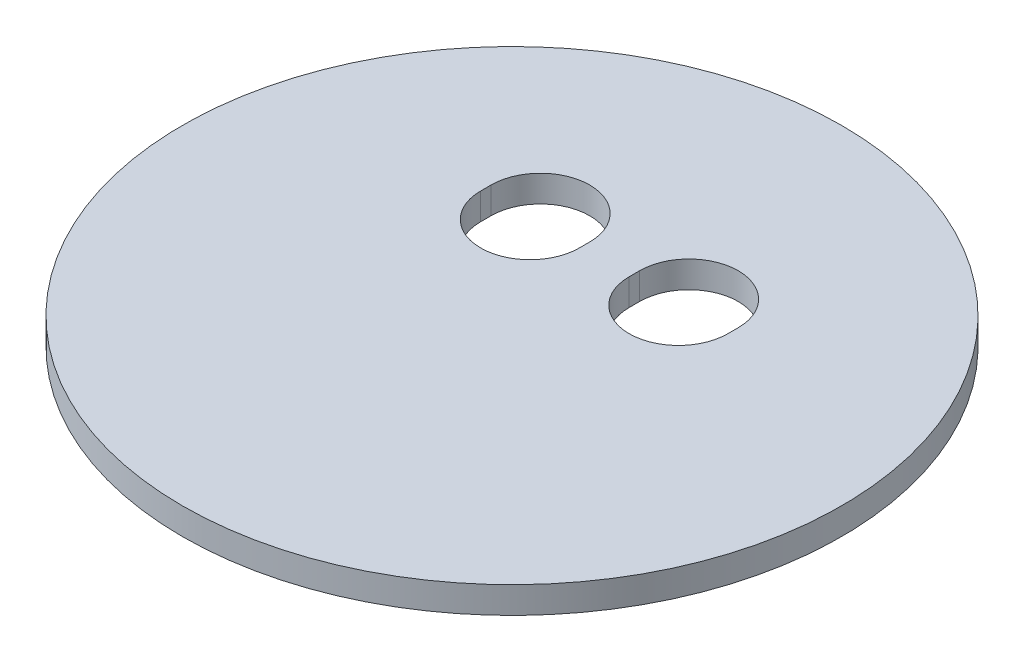
ISO-10303-21;
HEADER;
FILE_DESCRIPTION(('STEP AP214'),'2;1');
FILE_NAME('part.step','',(''),(''),'','','');
FILE_SCHEMA(('AUTOMOTIVE_DESIGN { 1 0 10303 214 1 1 1 1 }'));
ENDSEC;
DATA;
#1=APPLICATION_CONTEXT('core data for automotive mechanical design processes');
#2=APPLICATION_PROTOCOL_DEFINITION('international standard','automotive_design',2000,#1);
#3=PRODUCT_CONTEXT('',#1,'mechanical');
#4=PRODUCT('Part','Part','',(#3));
#5=PRODUCT_RELATED_PRODUCT_CATEGORY('part','',(#4));
#6=PRODUCT_DEFINITION_FORMATION('','',#4);
#7=PRODUCT_DEFINITION_CONTEXT('part definition',#1,'design');
#8=PRODUCT_DEFINITION('design','',#6,#7);
#9=PRODUCT_DEFINITION_SHAPE('','',#8);
#10=(LENGTH_UNIT() NAMED_UNIT(*) SI_UNIT(.MILLI.,.METRE.));
#11=(NAMED_UNIT(*) PLANE_ANGLE_UNIT() SI_UNIT($,.RADIAN.));
#12=(NAMED_UNIT(*) SI_UNIT($,.STERADIAN.) SOLID_ANGLE_UNIT());
#13=UNCERTAINTY_MEASURE_WITH_UNIT(LENGTH_MEASURE(1.E-05),#10,'distance_accuracy_value','');
#14=(GEOMETRIC_REPRESENTATION_CONTEXT(3) GLOBAL_UNCERTAINTY_ASSIGNED_CONTEXT((#13)) GLOBAL_UNIT_ASSIGNED_CONTEXT((#10,
#11,#12)) REPRESENTATION_CONTEXT('',''));
#15=CARTESIAN_POINT('',(0.,0.,0.));
#16=DIRECTION('',(0.,0.,1.));
#17=DIRECTION('',(1.,0.,0.));
#18=AXIS2_PLACEMENT_3D('',#15,#16,#17);
#19=CARTESIAN_POINT('',(0.,1.,0.));
#20=DIRECTION('',(0.,-1.,0.));
#21=DIRECTION('',(0.,0.,-1.));
#22=AXIS2_PLACEMENT_3D('',#19,#20,#21);
#23=CYLINDRICAL_SURFACE('',#22,12.36);
#24=CARTESIAN_POINT('',(0.,1.,0.));
#25=DIRECTION('',(0.,1.,0.));
#26=DIRECTION('',(0.,0.,1.));
#27=AXIS2_PLACEMENT_3D('',#24,#25,#26);
#28=CIRCLE('',#27,12.36);
#29=CARTESIAN_POINT('',(0.,1.,12.36));
#30=VERTEX_POINT('',#29);
#31=EDGE_CURVE('E11',#30,#30,#28,.T.);
#32=ORIENTED_EDGE('',*,*,#31,.F.);
#33=EDGE_LOOP('',(#32));
#34=FACE_BOUND('',#33,.T.);
#35=CARTESIAN_POINT('',(0.,0.,0.));
#36=DIRECTION('',(0.,1.,0.));
#37=DIRECTION('',(0.,0.,1.));
#38=AXIS2_PLACEMENT_3D('',#35,#36,#37);
#39=CIRCLE('',#38,12.36);
#40=CARTESIAN_POINT('',(0.,0.,12.36));
#41=VERTEX_POINT('',#40);
#42=EDGE_CURVE('E45',#41,#41,#39,.T.);
#43=ORIENTED_EDGE('',*,*,#42,.T.);
#44=EDGE_LOOP('',(#43));
#45=FACE_BOUND('',#44,.T.);
#46=ADVANCED_FACE('F42',(#34,#45),#23,.T.);
#47=CARTESIAN_POINT('',(0.,1.,0.));
#48=DIRECTION('',(0.,1.,0.));
#49=DIRECTION('',(0.,0.,1.));
#50=AXIS2_PLACEMENT_3D('',#47,#48,#49);
#51=PLANE('',#50);
#52=CARTESIAN_POINT('',(-2.785,1.,-3.85));
#53=DIRECTION('',(0.,1.,0.));
#54=DIRECTION('',(0.,0.,1.));
#55=AXIS2_PLACEMENT_3D('',#52,#53,#54);
#56=CIRCLE('',#55,1.85);
#57=CARTESIAN_POINT('',(-0.935000000000001,1.,-3.85));
#58=VERTEX_POINT('',#57);
#59=CARTESIAN_POINT('',(-4.635,1.,-3.85));
#60=VERTEX_POINT('',#59);
#61=EDGE_CURVE('E57',#58,#60,#56,.T.);
#62=ORIENTED_EDGE('',*,*,#61,.F.);
#63=DIRECTION('',(0.,0.,-1.));
#64=VECTOR('',#63,1.);
#65=CARTESIAN_POINT('',(-0.935000000000001,1.,-3.85));
#66=LINE('',#65,#64);
#67=CARTESIAN_POINT('',(-0.935000000000001,1.,-3.46000000000001));
#68=VERTEX_POINT('',#67);
#69=EDGE_CURVE('E131',#68,#58,#66,.T.);
#70=ORIENTED_EDGE('',*,*,#69,.F.);
#71=CARTESIAN_POINT('',(-2.785,1.,-3.46));
#72=DIRECTION('',(0.,1.,0.));
#73=DIRECTION('',(0.,0.,1.));
#74=AXIS2_PLACEMENT_3D('',#71,#72,#73);
#75=CIRCLE('',#74,1.85);
#76=CARTESIAN_POINT('',(-4.635,1.,-3.46));
#77=VERTEX_POINT('',#76);
#78=EDGE_CURVE('E135',#77,#68,#75,.T.);
#79=ORIENTED_EDGE('',*,*,#78,.F.);
#80=DIRECTION('',(0.,0.,1.));
#81=VECTOR('',#80,1.);
#82=CARTESIAN_POINT('',(-4.635,1.,-3.85));
#83=LINE('',#82,#81);
#84=EDGE_CURVE('E144',#60,#77,#83,.T.);
#85=ORIENTED_EDGE('',*,*,#84,.F.);
#86=EDGE_LOOP('',(#62,#70,#79,#85));
#87=FACE_BOUND('',#86,.T.);
#88=CARTESIAN_POINT('',(2.785,1.,-3.85));
#89=DIRECTION('',(0.,1.,0.));
#90=DIRECTION('',(0.,0.,1.));
#91=AXIS2_PLACEMENT_3D('',#88,#89,#90);
#92=CIRCLE('',#91,1.85);
#93=CARTESIAN_POINT('',(4.635,1.,-3.85));
#94=VERTEX_POINT('',#93);
#95=CARTESIAN_POINT('',(0.934999999999997,1.,-3.85));
#96=VERTEX_POINT('',#95);
#97=EDGE_CURVE('E65',#94,#96,#92,.T.);
#98=ORIENTED_EDGE('',*,*,#97,.F.);
#99=DIRECTION('',(0.,0.,-1.));
#100=VECTOR('',#99,1.);
#101=CARTESIAN_POINT('',(4.635,1.,-3.85));
#102=LINE('',#101,#100);
#103=CARTESIAN_POINT('',(4.635,1.,-3.46));
#104=VERTEX_POINT('',#103);
#105=EDGE_CURVE('E171',#104,#94,#102,.T.);
#106=ORIENTED_EDGE('',*,*,#105,.F.);
#107=CARTESIAN_POINT('',(2.785,1.,-3.46));
#108=DIRECTION('',(0.,1.,0.));
#109=DIRECTION('',(0.,0.,1.));
#110=AXIS2_PLACEMENT_3D('',#107,#108,#109);
#111=CIRCLE('',#110,1.85);
#112=CARTESIAN_POINT('',(0.934999999999996,1.,-3.46));
#113=VERTEX_POINT('',#112);
#114=EDGE_CURVE('E175',#113,#104,#111,.T.);
#115=ORIENTED_EDGE('',*,*,#114,.F.);
#116=DIRECTION('',(0.,0.,1.));
#117=VECTOR('',#116,1.);
#118=CARTESIAN_POINT('',(0.934999999999997,1.,-3.85));
#119=LINE('',#118,#117);
#120=EDGE_CURVE('E180',#96,#113,#119,.T.);
#121=ORIENTED_EDGE('',*,*,#120,.F.);
#122=EDGE_LOOP('',(#98,#106,#115,#121));
#123=FACE_BOUND('',#122,.T.);
#124=ORIENTED_EDGE('',*,*,#31,.T.);
#125=EDGE_LOOP('',(#124));
#126=FACE_BOUND('',#125,.T.);
#127=ADVANCED_FACE('F215',(#87,#123,#126),#51,.T.);
#128=CARTESIAN_POINT('',(0.,0.,0.));
#129=DIRECTION('',(0.,1.,0.));
#130=DIRECTION('',(0.,0.,1.));
#131=AXIS2_PLACEMENT_3D('',#128,#129,#130);
#132=PLANE('',#131);
#133=DIRECTION('',(0.,0.,-1.));
#134=VECTOR('',#133,1.);
#135=CARTESIAN_POINT('',(-0.935000000000001,0.,-3.85));
#136=LINE('',#135,#134);
#137=CARTESIAN_POINT('',(-0.935000000000001,0.,-3.46000000000001));
#138=VERTEX_POINT('',#137);
#139=CARTESIAN_POINT('',(-0.935000000000001,0.,-3.85));
#140=VERTEX_POINT('',#139);
#141=EDGE_CURVE('E116',#138,#140,#136,.T.);
#142=ORIENTED_EDGE('',*,*,#141,.T.);
#143=CARTESIAN_POINT('',(-2.785,0.,-3.85));
#144=DIRECTION('',(0.,1.,0.));
#145=DIRECTION('',(0.,0.,1.));
#146=AXIS2_PLACEMENT_3D('',#143,#144,#145);
#147=CIRCLE('',#146,1.85);
#148=CARTESIAN_POINT('',(-4.635,0.,-3.85));
#149=VERTEX_POINT('',#148);
#150=EDGE_CURVE('E109',#140,#149,#147,.T.);
#151=ORIENTED_EDGE('',*,*,#150,.T.);
#152=DIRECTION('',(0.,0.,1.));
#153=VECTOR('',#152,1.);
#154=CARTESIAN_POINT('',(-4.635,0.,-3.85));
#155=LINE('',#154,#153);
#156=CARTESIAN_POINT('',(-4.635,0.,-3.46));
#157=VERTEX_POINT('',#156);
#158=EDGE_CURVE('E120',#149,#157,#155,.T.);
#159=ORIENTED_EDGE('',*,*,#158,.T.);
#160=CARTESIAN_POINT('',(-2.785,0.,-3.46));
#161=DIRECTION('',(0.,1.,0.));
#162=DIRECTION('',(0.,0.,1.));
#163=AXIS2_PLACEMENT_3D('',#160,#161,#162);
#164=CIRCLE('',#163,1.85);
#165=EDGE_CURVE('E125',#157,#138,#164,.T.);
#166=ORIENTED_EDGE('',*,*,#165,.T.);
#167=EDGE_LOOP('',(#142,#151,#159,#166));
#168=FACE_BOUND('',#167,.T.);
#169=DIRECTION('',(0.,0.,-1.));
#170=VECTOR('',#169,1.);
#171=CARTESIAN_POINT('',(4.635,0.,-3.85));
#172=LINE('',#171,#170);
#173=CARTESIAN_POINT('',(4.635,0.,-3.46));
#174=VERTEX_POINT('',#173);
#175=CARTESIAN_POINT('',(4.635,0.,-3.85));
#176=VERTEX_POINT('',#175);
#177=EDGE_CURVE('E161',#174,#176,#172,.T.);
#178=ORIENTED_EDGE('',*,*,#177,.T.);
#179=CARTESIAN_POINT('',(2.785,0.,-3.85));
#180=DIRECTION('',(0.,1.,0.));
#181=DIRECTION('',(0.,0.,1.));
#182=AXIS2_PLACEMENT_3D('',#179,#180,#181);
#183=CIRCLE('',#182,1.85);
#184=CARTESIAN_POINT('',(0.934999999999997,0.,-3.85));
#185=VERTEX_POINT('',#184);
#186=EDGE_CURVE('E176',#176,#185,#183,.T.);
#187=ORIENTED_EDGE('',*,*,#186,.T.);
#188=DIRECTION('',(0.,0.,1.));
#189=VECTOR('',#188,1.);
#190=CARTESIAN_POINT('',(0.934999999999997,0.,-3.85));
#191=LINE('',#190,#189);
#192=CARTESIAN_POINT('',(0.934999999999997,0.,-3.46));
#193=VERTEX_POINT('',#192);
#194=EDGE_CURVE('E193',#185,#193,#191,.T.);
#195=ORIENTED_EDGE('',*,*,#194,.T.);
#196=CARTESIAN_POINT('',(2.785,0.,-3.46));
#197=DIRECTION('',(0.,1.,0.));
#198=DIRECTION('',(0.,0.,1.));
#199=AXIS2_PLACEMENT_3D('',#196,#197,#198);
#200=CIRCLE('',#199,1.85);
#201=EDGE_CURVE('E189',#193,#174,#200,.T.);
#202=ORIENTED_EDGE('',*,*,#201,.T.);
#203=EDGE_LOOP('',(#178,#187,#195,#202));
#204=FACE_BOUND('',#203,.T.);
#205=ORIENTED_EDGE('',*,*,#42,.F.);
#206=EDGE_LOOP('',(#205));
#207=FACE_BOUND('',#206,.T.);
#208=ADVANCED_FACE('F127',(#168,#204,#207),#132,.F.);
#209=CARTESIAN_POINT('',(2.785,0.,-3.85));
#210=DIRECTION('',(0.,1.,0.));
#211=DIRECTION('',(0.,0.,1.));
#212=AXIS2_PLACEMENT_3D('',#209,#210,#211);
#213=CYLINDRICAL_SURFACE('',#212,1.85);
#214=ORIENTED_EDGE('',*,*,#97,.T.);
#215=DIRECTION('',(0.,1.,0.));
#216=VECTOR('',#215,1.);
#217=CARTESIAN_POINT('',(0.934999999999997,0.,-3.85));
#218=LINE('',#217,#216);
#219=EDGE_CURVE('E158',#185,#96,#218,.T.);
#220=ORIENTED_EDGE('',*,*,#219,.F.);
#221=ORIENTED_EDGE('',*,*,#186,.F.);
#222=DIRECTION('',(0.,1.,0.));
#223=VECTOR('',#222,1.);
#224=CARTESIAN_POINT('',(4.635,0.,-3.85));
#225=LINE('',#224,#223);
#226=EDGE_CURVE('E168',#176,#94,#225,.T.);
#227=ORIENTED_EDGE('',*,*,#226,.T.);
#228=EDGE_LOOP('',(#214,#220,#221,#227));
#229=FACE_BOUND('',#228,.T.);
#230=ADVANCED_FACE('F203',(#229),#213,.F.);
#231=CARTESIAN_POINT('',(4.635,0.,-3.85));
#232=DIRECTION('',(1.,0.,0.));
#233=DIRECTION('',(0.,0.,-1.));
#234=AXIS2_PLACEMENT_3D('',#231,#232,#233);
#235=PLANE('',#234);
#236=ORIENTED_EDGE('',*,*,#105,.T.);
#237=ORIENTED_EDGE('',*,*,#226,.F.);
#238=ORIENTED_EDGE('',*,*,#177,.F.);
#239=DIRECTION('',(0.,1.,0.));
#240=VECTOR('',#239,1.);
#241=CARTESIAN_POINT('',(4.635,0.,-3.46));
#242=LINE('',#241,#240);
#243=EDGE_CURVE('E165',#174,#104,#242,.T.);
#244=ORIENTED_EDGE('',*,*,#243,.T.);
#245=EDGE_LOOP('',(#236,#237,#238,#244));
#246=FACE_BOUND('',#245,.T.);
#247=ADVANCED_FACE('F213',(#246),#235,.F.);
#248=CARTESIAN_POINT('',(2.785,0.,-3.46));
#249=DIRECTION('',(0.,1.,0.));
#250=DIRECTION('',(0.,0.,1.));
#251=AXIS2_PLACEMENT_3D('',#248,#249,#250);
#252=CYLINDRICAL_SURFACE('',#251,1.85);
#253=ORIENTED_EDGE('',*,*,#114,.T.);
#254=ORIENTED_EDGE('',*,*,#243,.F.);
#255=ORIENTED_EDGE('',*,*,#201,.F.);
#256=DIRECTION('',(0.,1.,0.));
#257=VECTOR('',#256,1.);
#258=CARTESIAN_POINT('',(0.934999999999996,0.,-3.46));
#259=LINE('',#258,#257);
#260=EDGE_CURVE('E162',#193,#113,#259,.T.);
#261=ORIENTED_EDGE('',*,*,#260,.T.);
#262=EDGE_LOOP('',(#253,#254,#255,#261));
#263=FACE_BOUND('',#262,.T.);
#264=ADVANCED_FACE('F210',(#263),#252,.F.);
#265=CARTESIAN_POINT('',(0.934999999999997,0.,-3.85));
#266=DIRECTION('',(-1.,0.,0.));
#267=DIRECTION('',(0.,0.,1.));
#268=AXIS2_PLACEMENT_3D('',#265,#266,#267);
#269=PLANE('',#268);
#270=ORIENTED_EDGE('',*,*,#120,.T.);
#271=ORIENTED_EDGE('',*,*,#260,.F.);
#272=ORIENTED_EDGE('',*,*,#194,.F.);
#273=ORIENTED_EDGE('',*,*,#219,.T.);
#274=EDGE_LOOP('',(#270,#271,#272,#273));
#275=FACE_BOUND('',#274,.T.);
#276=ADVANCED_FACE('F207',(#275),#269,.F.);
#277=CARTESIAN_POINT('',(-2.785,0.,-3.85));
#278=DIRECTION('',(0.,1.,0.));
#279=DIRECTION('',(0.,0.,1.));
#280=AXIS2_PLACEMENT_3D('',#277,#278,#279);
#281=CYLINDRICAL_SURFACE('',#280,1.85);
#282=ORIENTED_EDGE('',*,*,#61,.T.);
#283=DIRECTION('',(0.,1.,0.));
#284=VECTOR('',#283,1.);
#285=CARTESIAN_POINT('',(-4.635,0.,-3.85));
#286=LINE('',#285,#284);
#287=EDGE_CURVE('E105',#149,#60,#286,.T.);
#288=ORIENTED_EDGE('',*,*,#287,.F.);
#289=ORIENTED_EDGE('',*,*,#150,.F.);
#290=DIRECTION('',(0.,1.,0.));
#291=VECTOR('',#290,1.);
#292=CARTESIAN_POINT('',(-0.935000000000001,0.,-3.85));
#293=LINE('',#292,#291);
#294=EDGE_CURVE('E150',#140,#58,#293,.T.);
#295=ORIENTED_EDGE('',*,*,#294,.T.);
#296=EDGE_LOOP('',(#282,#288,#289,#295));
#297=FACE_BOUND('',#296,.T.);
#298=ADVANCED_FACE('F107',(#297),#281,.F.);
#299=CARTESIAN_POINT('',(-0.935000000000001,0.,-3.85));
#300=DIRECTION('',(1.,0.,0.));
#301=DIRECTION('',(0.,0.,-1.));
#302=AXIS2_PLACEMENT_3D('',#299,#300,#301);
#303=PLANE('',#302);
#304=ORIENTED_EDGE('',*,*,#69,.T.);
#305=ORIENTED_EDGE('',*,*,#294,.F.);
#306=ORIENTED_EDGE('',*,*,#141,.F.);
#307=DIRECTION('',(0.,1.,0.));
#308=VECTOR('',#307,1.);
#309=CARTESIAN_POINT('',(-0.935000000000001,0.,-3.46000000000001));
#310=LINE('',#309,#308);
#311=EDGE_CURVE('E153',#138,#68,#310,.T.);
#312=ORIENTED_EDGE('',*,*,#311,.T.);
#313=EDGE_LOOP('',(#304,#305,#306,#312));
#314=FACE_BOUND('',#313,.T.);
#315=ADVANCED_FACE('F241',(#314),#303,.F.);
#316=CARTESIAN_POINT('',(-2.785,0.,-3.46));
#317=DIRECTION('',(0.,1.,0.));
#318=DIRECTION('',(0.,0.,1.));
#319=AXIS2_PLACEMENT_3D('',#316,#317,#318);
#320=CYLINDRICAL_SURFACE('',#319,1.85);
#321=ORIENTED_EDGE('',*,*,#78,.T.);
#322=ORIENTED_EDGE('',*,*,#311,.F.);
#323=ORIENTED_EDGE('',*,*,#165,.F.);
#324=DIRECTION('',(0.,1.,0.));
#325=VECTOR('',#324,1.);
#326=CARTESIAN_POINT('',(-4.635,0.,-3.46));
#327=LINE('',#326,#325);
#328=EDGE_CURVE('E115',#157,#77,#327,.T.);
#329=ORIENTED_EDGE('',*,*,#328,.T.);
#330=EDGE_LOOP('',(#321,#322,#323,#329));
#331=FACE_BOUND('',#330,.T.);
#332=ADVANCED_FACE('F244',(#331),#320,.F.);
#333=CARTESIAN_POINT('',(-4.635,0.,-3.85));
#334=DIRECTION('',(-1.,0.,0.));
#335=DIRECTION('',(0.,0.,1.));
#336=AXIS2_PLACEMENT_3D('',#333,#334,#335);
#337=PLANE('',#336);
#338=ORIENTED_EDGE('',*,*,#84,.T.);
#339=ORIENTED_EDGE('',*,*,#328,.F.);
#340=ORIENTED_EDGE('',*,*,#158,.F.);
#341=ORIENTED_EDGE('',*,*,#287,.T.);
#342=EDGE_LOOP('',(#338,#339,#340,#341));
#343=FACE_BOUND('',#342,.T.);
#344=ADVANCED_FACE('F121',(#343),#337,.F.);
#345=CLOSED_SHELL('',(#46,#127,#208,#230,#247,#264,#276,#298,#315,#332,#344));
#346=MANIFOLD_SOLID_BREP('B2',#345);
#347=ADVANCED_BREP_SHAPE_REPRESENTATION('',(#18,#346),#14);
#348=SHAPE_DEFINITION_REPRESENTATION(#9,#347);
ENDSEC;
END-ISO-10303-21;
